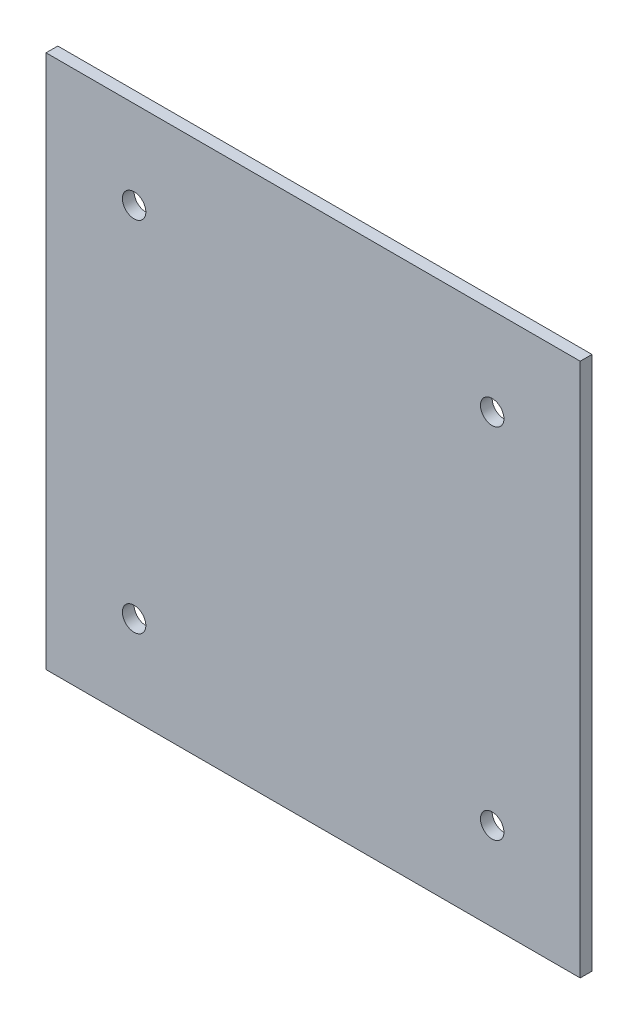
ISO-10303-21;
HEADER;
FILE_DESCRIPTION(('STEP AP214'),'2;1');
FILE_NAME('part.step','',(''),(''),'','','');
FILE_SCHEMA(('AUTOMOTIVE_DESIGN { 1 0 10303 214 1 1 1 1 }'));
ENDSEC;
DATA;
#1=APPLICATION_CONTEXT('core data for automotive mechanical design processes');
#2=APPLICATION_PROTOCOL_DEFINITION('international standard','automotive_design',2000,#1);
#3=PRODUCT_CONTEXT('',#1,'mechanical');
#4=PRODUCT('Part','Part','',(#3));
#5=PRODUCT_RELATED_PRODUCT_CATEGORY('part','',(#4));
#6=PRODUCT_DEFINITION_FORMATION('','',#4);
#7=PRODUCT_DEFINITION_CONTEXT('part definition',#1,'design');
#8=PRODUCT_DEFINITION('design','',#6,#7);
#9=PRODUCT_DEFINITION_SHAPE('','',#8);
#10=(LENGTH_UNIT() NAMED_UNIT(*) SI_UNIT(.MILLI.,.METRE.));
#11=(NAMED_UNIT(*) PLANE_ANGLE_UNIT() SI_UNIT($,.RADIAN.));
#12=(NAMED_UNIT(*) SI_UNIT($,.STERADIAN.) SOLID_ANGLE_UNIT());
#13=UNCERTAINTY_MEASURE_WITH_UNIT(LENGTH_MEASURE(1.E-05),#10,'distance_accuracy_value','');
#14=(GEOMETRIC_REPRESENTATION_CONTEXT(3) GLOBAL_UNCERTAINTY_ASSIGNED_CONTEXT((#13)) GLOBAL_UNIT_ASSIGNED_CONTEXT((#10,
#11,#12)) REPRESENTATION_CONTEXT('',''));
#15=CARTESIAN_POINT('',(0.,0.,0.));
#16=DIRECTION('',(0.,0.,1.));
#17=DIRECTION('',(1.,0.,0.));
#18=AXIS2_PLACEMENT_3D('',#15,#16,#17);
#19=CARTESIAN_POINT('',(0.,0.,2.));
#20=DIRECTION('',(1.,0.,0.));
#21=DIRECTION('',(0.,0.,-1.));
#22=AXIS2_PLACEMENT_3D('',#19,#20,#21);
#23=PLANE('',#22);
#24=DIRECTION('',(0.,-1.,0.));
#25=VECTOR('',#24,1.);
#26=CARTESIAN_POINT('',(0.,0.,-2.));
#27=LINE('',#26,#25);
#28=CARTESIAN_POINT('',(0.,182.,-2.));
#29=VERTEX_POINT('',#28);
#30=CARTESIAN_POINT('',(0.,0.,-2.));
#31=VERTEX_POINT('',#30);
#32=EDGE_CURVE('E112',#29,#31,#27,.T.);
#33=ORIENTED_EDGE('',*,*,#32,.T.);
#34=DIRECTION('',(0.,0.,-1.));
#35=VECTOR('',#34,1.);
#36=CARTESIAN_POINT('',(0.,0.,2.));
#37=LINE('',#36,#35);
#38=CARTESIAN_POINT('',(0.,0.,2.));
#39=VERTEX_POINT('',#38);
#40=EDGE_CURVE('E11',#39,#31,#37,.T.);
#41=ORIENTED_EDGE('',*,*,#40,.F.);
#42=DIRECTION('',(0.,-1.,0.));
#43=VECTOR('',#42,1.);
#44=CARTESIAN_POINT('',(0.,0.,2.));
#45=LINE('',#44,#43);
#46=CARTESIAN_POINT('',(0.,182.,2.));
#47=VERTEX_POINT('',#46);
#48=EDGE_CURVE('E96',#47,#39,#45,.T.);
#49=ORIENTED_EDGE('',*,*,#48,.F.);
#50=DIRECTION('',(0.,0.,-1.));
#51=VECTOR('',#50,1.);
#52=CARTESIAN_POINT('',(0.,182.,2.));
#53=LINE('',#52,#51);
#54=EDGE_CURVE('E108',#47,#29,#53,.T.);
#55=ORIENTED_EDGE('',*,*,#54,.T.);
#56=EDGE_LOOP('',(#33,#41,#49,#55));
#57=FACE_BOUND('',#56,.T.);
#58=ADVANCED_FACE('F44',(#57),#23,.F.);
#59=CARTESIAN_POINT('',(0.,0.,2.));
#60=DIRECTION('',(0.,1.,0.));
#61=DIRECTION('',(0.,0.,1.));
#62=AXIS2_PLACEMENT_3D('',#59,#60,#61);
#63=PLANE('',#62);
#64=DIRECTION('',(1.,0.,0.));
#65=VECTOR('',#64,1.);
#66=CARTESIAN_POINT('',(0.,0.,-2.));
#67=LINE('',#66,#65);
#68=CARTESIAN_POINT('',(182.,0.,-2.));
#69=VERTEX_POINT('',#68);
#70=EDGE_CURVE('E101',#31,#69,#67,.T.);
#71=ORIENTED_EDGE('',*,*,#70,.T.);
#72=DIRECTION('',(0.,0.,-1.));
#73=VECTOR('',#72,1.);
#74=CARTESIAN_POINT('',(182.,0.,2.));
#75=LINE('',#74,#73);
#76=CARTESIAN_POINT('',(182.,0.,2.));
#77=VERTEX_POINT('',#76);
#78=EDGE_CURVE('E53',#77,#69,#75,.T.);
#79=ORIENTED_EDGE('',*,*,#78,.F.);
#80=DIRECTION('',(1.,0.,0.));
#81=VECTOR('',#80,1.);
#82=CARTESIAN_POINT('',(0.,0.,2.));
#83=LINE('',#82,#81);
#84=EDGE_CURVE('E91',#39,#77,#83,.T.);
#85=ORIENTED_EDGE('',*,*,#84,.F.);
#86=ORIENTED_EDGE('',*,*,#40,.T.);
#87=EDGE_LOOP('',(#71,#79,#85,#86));
#88=FACE_BOUND('',#87,.T.);
#89=ADVANCED_FACE('F100',(#88),#63,.F.);
#90=CARTESIAN_POINT('',(182.,0.,2.));
#91=DIRECTION('',(-1.,0.,0.));
#92=DIRECTION('',(0.,0.,1.));
#93=AXIS2_PLACEMENT_3D('',#90,#91,#92);
#94=PLANE('',#93);
#95=DIRECTION('',(0.,1.,0.));
#96=VECTOR('',#95,1.);
#97=CARTESIAN_POINT('',(182.,0.,-2.));
#98=LINE('',#97,#96);
#99=CARTESIAN_POINT('',(182.,182.,-2.));
#100=VERTEX_POINT('',#99);
#101=EDGE_CURVE('E78',#69,#100,#98,.T.);
#102=ORIENTED_EDGE('',*,*,#101,.T.);
#103=DIRECTION('',(0.,0.,-1.));
#104=VECTOR('',#103,1.);
#105=CARTESIAN_POINT('',(182.,182.,2.));
#106=LINE('',#105,#104);
#107=CARTESIAN_POINT('',(182.,182.,2.));
#108=VERTEX_POINT('',#107);
#109=EDGE_CURVE('E103',#108,#100,#106,.T.);
#110=ORIENTED_EDGE('',*,*,#109,.F.);
#111=DIRECTION('',(0.,1.,0.));
#112=VECTOR('',#111,1.);
#113=CARTESIAN_POINT('',(182.,0.,2.));
#114=LINE('',#113,#112);
#115=EDGE_CURVE('E94',#77,#108,#114,.T.);
#116=ORIENTED_EDGE('',*,*,#115,.F.);
#117=ORIENTED_EDGE('',*,*,#78,.T.);
#118=EDGE_LOOP('',(#102,#110,#116,#117));
#119=FACE_BOUND('',#118,.T.);
#120=ADVANCED_FACE('F104',(#119),#94,.F.);
#121=CARTESIAN_POINT('',(0.,182.,2.));
#122=DIRECTION('',(0.,-1.,0.));
#123=DIRECTION('',(0.,0.,-1.));
#124=AXIS2_PLACEMENT_3D('',#121,#122,#123);
#125=PLANE('',#124);
#126=DIRECTION('',(-1.,0.,0.));
#127=VECTOR('',#126,1.);
#128=CARTESIAN_POINT('',(0.,182.,-2.));
#129=LINE('',#128,#127);
#130=EDGE_CURVE('E84',#100,#29,#129,.T.);
#131=ORIENTED_EDGE('',*,*,#130,.T.);
#132=ORIENTED_EDGE('',*,*,#54,.F.);
#133=DIRECTION('',(-1.,0.,0.));
#134=VECTOR('',#133,1.);
#135=CARTESIAN_POINT('',(0.,182.,2.));
#136=LINE('',#135,#134);
#137=EDGE_CURVE('E61',#108,#47,#136,.T.);
#138=ORIENTED_EDGE('',*,*,#137,.F.);
#139=ORIENTED_EDGE('',*,*,#109,.T.);
#140=EDGE_LOOP('',(#131,#132,#138,#139));
#141=FACE_BOUND('',#140,.T.);
#142=ADVANCED_FACE('F126',(#141),#125,.F.);
#143=CARTESIAN_POINT('',(0.,0.,2.));
#144=DIRECTION('',(0.,0.,-1.));
#145=DIRECTION('',(-1.,0.,0.));
#146=AXIS2_PLACEMENT_3D('',#143,#144,#145);
#147=PLANE('',#146);
#148=CARTESIAN_POINT('',(30.0000000000013,30.,2.));
#149=DIRECTION('',(0.,0.,1.));
#150=DIRECTION('',(1.,0.,0.));
#151=AXIS2_PLACEMENT_3D('',#148,#149,#150);
#152=CIRCLE('',#151,4.00000000000001);
#153=CARTESIAN_POINT('',(34.0000000000013,30.,2.));
#154=VERTEX_POINT('',#153);
#155=EDGE_CURVE('E145',#154,#154,#152,.T.);
#156=ORIENTED_EDGE('',*,*,#155,.F.);
#157=EDGE_LOOP('',(#156));
#158=FACE_BOUND('',#157,.T.);
#159=CARTESIAN_POINT('',(152.000000000001,30.,2.));
#160=DIRECTION('',(0.,0.,1.));
#161=DIRECTION('',(1.,0.,0.));
#162=AXIS2_PLACEMENT_3D('',#159,#160,#161);
#163=CIRCLE('',#162,4.00000000000002);
#164=CARTESIAN_POINT('',(156.000000000001,30.,2.));
#165=VERTEX_POINT('',#164);
#166=EDGE_CURVE('E153',#165,#165,#163,.T.);
#167=ORIENTED_EDGE('',*,*,#166,.F.);
#168=EDGE_LOOP('',(#167));
#169=FACE_BOUND('',#168,.T.);
#170=CARTESIAN_POINT('',(152.,152.,2.));
#171=DIRECTION('',(0.,0.,1.));
#172=DIRECTION('',(1.,0.,0.));
#173=AXIS2_PLACEMENT_3D('',#170,#171,#172);
#174=CIRCLE('',#173,4.00000000000002);
#175=CARTESIAN_POINT('',(156.,152.,2.));
#176=VERTEX_POINT('',#175);
#177=EDGE_CURVE('E137',#176,#176,#174,.T.);
#178=ORIENTED_EDGE('',*,*,#177,.F.);
#179=EDGE_LOOP('',(#178));
#180=FACE_BOUND('',#179,.T.);
#181=CARTESIAN_POINT('',(30.,152.,2.));
#182=DIRECTION('',(0.,0.,1.));
#183=DIRECTION('',(1.,0.,0.));
#184=AXIS2_PLACEMENT_3D('',#181,#182,#183);
#185=CIRCLE('',#184,4.00000000000001);
#186=CARTESIAN_POINT('',(34.,152.,2.));
#187=VERTEX_POINT('',#186);
#188=EDGE_CURVE('E133',#187,#187,#185,.T.);
#189=ORIENTED_EDGE('',*,*,#188,.F.);
#190=EDGE_LOOP('',(#189));
#191=FACE_BOUND('',#190,.T.);
#192=ORIENTED_EDGE('',*,*,#48,.T.);
#193=ORIENTED_EDGE('',*,*,#84,.T.);
#194=ORIENTED_EDGE('',*,*,#115,.T.);
#195=ORIENTED_EDGE('',*,*,#137,.T.);
#196=EDGE_LOOP('',(#192,#193,#194,#195));
#197=FACE_BOUND('',#196,.T.);
#198=ADVANCED_FACE('F92',(#158,#169,#180,#191,#197),#147,.F.);
#199=CARTESIAN_POINT('',(0.,0.,-2.));
#200=DIRECTION('',(0.,0.,-1.));
#201=DIRECTION('',(-1.,0.,0.));
#202=AXIS2_PLACEMENT_3D('',#199,#200,#201);
#203=PLANE('',#202);
#204=CARTESIAN_POINT('',(30.0000000000013,30.,-2.));
#205=DIRECTION('',(0.,0.,1.));
#206=DIRECTION('',(1.,0.,0.));
#207=AXIS2_PLACEMENT_3D('',#204,#205,#206);
#208=CIRCLE('',#207,4.00000000000001);
#209=CARTESIAN_POINT('',(34.0000000000013,30.,-2.));
#210=VERTEX_POINT('',#209);
#211=EDGE_CURVE('E141',#210,#210,#208,.T.);
#212=ORIENTED_EDGE('',*,*,#211,.T.);
#213=EDGE_LOOP('',(#212));
#214=FACE_BOUND('',#213,.T.);
#215=CARTESIAN_POINT('',(152.000000000001,30.,-2.));
#216=DIRECTION('',(0.,0.,1.));
#217=DIRECTION('',(1.,0.,0.));
#218=AXIS2_PLACEMENT_3D('',#215,#216,#217);
#219=CIRCLE('',#218,4.00000000000002);
#220=CARTESIAN_POINT('',(156.000000000001,30.,-2.));
#221=VERTEX_POINT('',#220);
#222=EDGE_CURVE('E149',#221,#221,#219,.T.);
#223=ORIENTED_EDGE('',*,*,#222,.T.);
#224=EDGE_LOOP('',(#223));
#225=FACE_BOUND('',#224,.T.);
#226=CARTESIAN_POINT('',(152.,152.,-2.));
#227=DIRECTION('',(0.,0.,1.));
#228=DIRECTION('',(1.,0.,0.));
#229=AXIS2_PLACEMENT_3D('',#226,#227,#228);
#230=CIRCLE('',#229,4.00000000000002);
#231=CARTESIAN_POINT('',(156.,152.,-2.));
#232=VERTEX_POINT('',#231);
#233=EDGE_CURVE('E157',#232,#232,#230,.T.);
#234=ORIENTED_EDGE('',*,*,#233,.T.);
#235=EDGE_LOOP('',(#234));
#236=FACE_BOUND('',#235,.T.);
#237=CARTESIAN_POINT('',(30.,152.,-2.));
#238=DIRECTION('',(0.,0.,1.));
#239=DIRECTION('',(1.,0.,0.));
#240=AXIS2_PLACEMENT_3D('',#237,#238,#239);
#241=CIRCLE('',#240,4.00000000000001);
#242=CARTESIAN_POINT('',(34.,152.,-2.));
#243=VERTEX_POINT('',#242);
#244=EDGE_CURVE('E116',#243,#243,#241,.T.);
#245=ORIENTED_EDGE('',*,*,#244,.T.);
#246=EDGE_LOOP('',(#245));
#247=FACE_BOUND('',#246,.T.);
#248=ORIENTED_EDGE('',*,*,#32,.F.);
#249=ORIENTED_EDGE('',*,*,#130,.F.);
#250=ORIENTED_EDGE('',*,*,#101,.F.);
#251=ORIENTED_EDGE('',*,*,#70,.F.);
#252=EDGE_LOOP('',(#248,#249,#250,#251));
#253=FACE_BOUND('',#252,.T.);
#254=ADVANCED_FACE('F129',(#214,#225,#236,#247,#253),#203,.T.);
#255=CARTESIAN_POINT('',(30.,152.,-2.));
#256=DIRECTION('',(0.,0.,1.));
#257=DIRECTION('',(1.,0.,0.));
#258=AXIS2_PLACEMENT_3D('',#255,#256,#257);
#259=CYLINDRICAL_SURFACE('',#258,4.00000000000001);
#260=ORIENTED_EDGE('',*,*,#244,.F.);
#261=EDGE_LOOP('',(#260));
#262=FACE_BOUND('',#261,.T.);
#263=ORIENTED_EDGE('',*,*,#188,.T.);
#264=EDGE_LOOP('',(#263));
#265=FACE_BOUND('',#264,.T.);
#266=ADVANCED_FACE('F173',(#262,#265),#259,.F.);
#267=CARTESIAN_POINT('',(152.,152.,-2.));
#268=DIRECTION('',(0.,0.,1.));
#269=DIRECTION('',(1.,0.,0.));
#270=AXIS2_PLACEMENT_3D('',#267,#268,#269);
#271=CYLINDRICAL_SURFACE('',#270,4.00000000000002);
#272=ORIENTED_EDGE('',*,*,#233,.F.);
#273=EDGE_LOOP('',(#272));
#274=FACE_BOUND('',#273,.T.);
#275=ORIENTED_EDGE('',*,*,#177,.T.);
#276=EDGE_LOOP('',(#275));
#277=FACE_BOUND('',#276,.T.);
#278=ADVANCED_FACE('F165',(#274,#277),#271,.F.);
#279=CARTESIAN_POINT('',(152.000000000001,30.,-2.));
#280=DIRECTION('',(0.,0.,1.));
#281=DIRECTION('',(1.,0.,0.));
#282=AXIS2_PLACEMENT_3D('',#279,#280,#281);
#283=CYLINDRICAL_SURFACE('',#282,4.00000000000002);
#284=ORIENTED_EDGE('',*,*,#222,.F.);
#285=EDGE_LOOP('',(#284));
#286=FACE_BOUND('',#285,.T.);
#287=ORIENTED_EDGE('',*,*,#166,.T.);
#288=EDGE_LOOP('',(#287));
#289=FACE_BOUND('',#288,.T.);
#290=ADVANCED_FACE('F181',(#286,#289),#283,.F.);
#291=CARTESIAN_POINT('',(30.0000000000013,30.,-2.));
#292=DIRECTION('',(0.,0.,1.));
#293=DIRECTION('',(1.,0.,0.));
#294=AXIS2_PLACEMENT_3D('',#291,#292,#293);
#295=CYLINDRICAL_SURFACE('',#294,4.00000000000001);
#296=ORIENTED_EDGE('',*,*,#211,.F.);
#297=EDGE_LOOP('',(#296));
#298=FACE_BOUND('',#297,.T.);
#299=ORIENTED_EDGE('',*,*,#155,.T.);
#300=EDGE_LOOP('',(#299));
#301=FACE_BOUND('',#300,.T.);
#302=ADVANCED_FACE('F232',(#298,#301),#295,.F.);
#303=CLOSED_SHELL('',(#58,#89,#120,#142,#198,#254,#266,#278,#290,#302));
#304=MANIFOLD_SOLID_BREP('B2',#303);
#305=ADVANCED_BREP_SHAPE_REPRESENTATION('',(#18,#304),#14);
#306=SHAPE_DEFINITION_REPRESENTATION(#9,#305);
ENDSEC;
END-ISO-10303-21;
